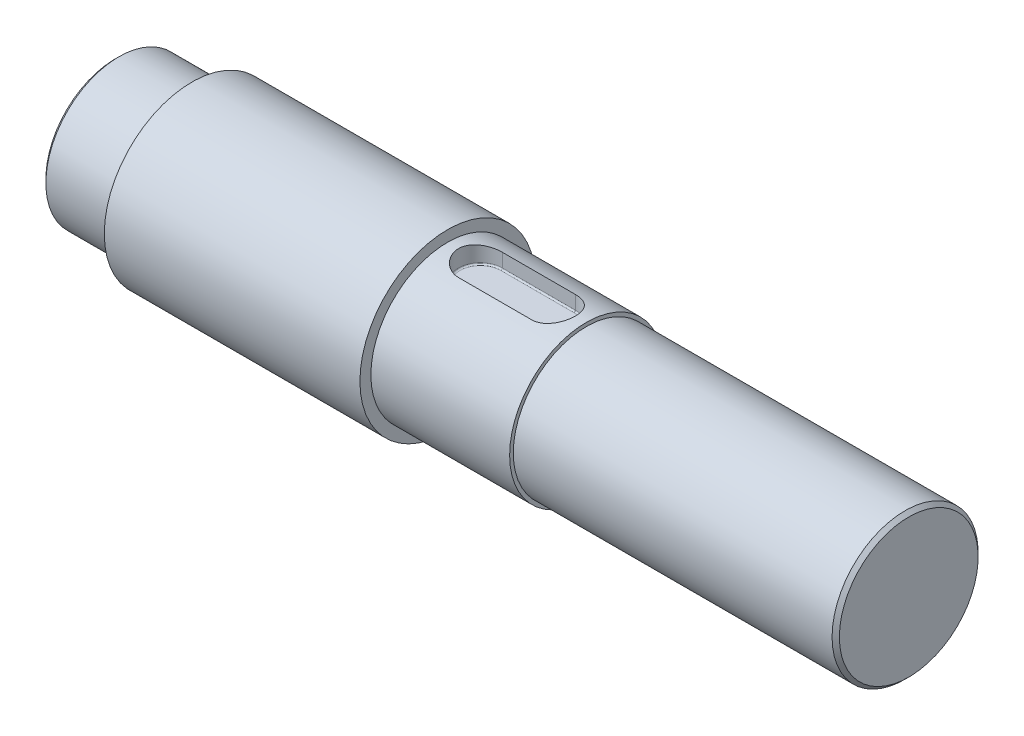
ISO-10303-21;
HEADER;
FILE_DESCRIPTION(('STEP AP214'),'2;1');
FILE_NAME('part.step','',(''),(''),'','','');
FILE_SCHEMA(('AUTOMOTIVE_DESIGN { 1 0 10303 214 1 1 1 1 }'));
ENDSEC;
DATA;
#1=APPLICATION_CONTEXT('core data for automotive mechanical design processes');
#2=APPLICATION_PROTOCOL_DEFINITION('international standard','automotive_design',2000,#1);
#3=PRODUCT_CONTEXT('',#1,'mechanical');
#4=PRODUCT('Part','Part','',(#3));
#5=PRODUCT_RELATED_PRODUCT_CATEGORY('part','',(#4));
#6=PRODUCT_DEFINITION_FORMATION('','',#4);
#7=PRODUCT_DEFINITION_CONTEXT('part definition',#1,'design');
#8=PRODUCT_DEFINITION('design','',#6,#7);
#9=PRODUCT_DEFINITION_SHAPE('','',#8);
#10=(LENGTH_UNIT() NAMED_UNIT(*) SI_UNIT(.MILLI.,.METRE.));
#11=(NAMED_UNIT(*) PLANE_ANGLE_UNIT() SI_UNIT($,.RADIAN.));
#12=(NAMED_UNIT(*) SI_UNIT($,.STERADIAN.) SOLID_ANGLE_UNIT());
#13=UNCERTAINTY_MEASURE_WITH_UNIT(LENGTH_MEASURE(1.E-05),#10,'distance_accuracy_value','');
#14=(GEOMETRIC_REPRESENTATION_CONTEXT(3) GLOBAL_UNCERTAINTY_ASSIGNED_CONTEXT((#13)) GLOBAL_UNIT_ASSIGNED_CONTEXT((#10,
#11,#12)) REPRESENTATION_CONTEXT('',''));
#15=CARTESIAN_POINT('',(0.,0.,0.));
#16=DIRECTION('',(0.,0.,1.));
#17=DIRECTION('',(1.,0.,0.));
#18=AXIS2_PLACEMENT_3D('',#15,#16,#17);
#19=CARTESIAN_POINT('',(216.8,0.,0.));
#20=DIRECTION('',(-1.,0.,0.));
#21=DIRECTION('',(0.,0.,-1.));
#22=AXIS2_PLACEMENT_3D('',#19,#20,#21);
#23=CONICAL_SURFACE('',#22,19.5,0.785398163397448);
#24=CARTESIAN_POINT('',(217.3,0.,0.));
#25=DIRECTION('',(1.,0.,0.));
#26=DIRECTION('',(0.,0.,1.));
#27=AXIS2_PLACEMENT_3D('',#24,#25,#26);
#28=CIRCLE('',#27,19.);
#29=CARTESIAN_POINT('',(217.3,0.,19.));
#30=VERTEX_POINT('',#29);
#31=EDGE_CURVE('E112',#30,#30,#28,.T.);
#32=ORIENTED_EDGE('',*,*,#31,.F.);
#33=EDGE_LOOP('',(#32));
#34=FACE_BOUND('',#33,.T.);
#35=CARTESIAN_POINT('',(216.3,0.,0.));
#36=DIRECTION('',(1.,0.,0.));
#37=DIRECTION('',(0.,0.,1.));
#38=AXIS2_PLACEMENT_3D('',#35,#36,#37);
#39=CIRCLE('',#38,20.);
#40=CARTESIAN_POINT('',(216.3,0.,20.));
#41=VERTEX_POINT('',#40);
#42=EDGE_CURVE('E123',#41,#41,#39,.T.);
#43=ORIENTED_EDGE('',*,*,#42,.T.);
#44=EDGE_LOOP('',(#43));
#45=FACE_BOUND('',#44,.T.);
#46=ADVANCED_FACE('F16',(#34,#45),#23,.T.);
#47=CARTESIAN_POINT('',(0.,0.,0.));
#48=DIRECTION('',(-1.,0.,0.));
#49=DIRECTION('',(0.,1.,0.));
#50=AXIS2_PLACEMENT_3D('',#47,#48,#49);
#51=PLANE('',#50);
#52=CARTESIAN_POINT('',(0.,0.,0.));
#53=DIRECTION('',(-1.,0.,0.));
#54=DIRECTION('',(0.,0.,-1.));
#55=AXIS2_PLACEMENT_3D('',#52,#53,#54);
#56=CIRCLE('',#55,19.);
#57=CARTESIAN_POINT('',(0.,0.,-19.));
#58=VERTEX_POINT('',#57);
#59=EDGE_CURVE('E10',#58,#58,#56,.T.);
#60=ORIENTED_EDGE('',*,*,#59,.T.);
#61=EDGE_LOOP('',(#60));
#62=FACE_BOUND('',#61,.T.);
#63=ADVANCED_FACE('F280',(#62),#51,.T.);
#64=CARTESIAN_POINT('',(0.5,0.,0.));
#65=DIRECTION('',(1.,0.,0.));
#66=DIRECTION('',(0.,0.,1.));
#67=AXIS2_PLACEMENT_3D('',#64,#65,#66);
#68=CONICAL_SURFACE('',#67,19.5,0.78539816339745);
#69=CARTESIAN_POINT('',(1.,0.,0.));
#70=DIRECTION('',(-1.,0.,0.));
#71=DIRECTION('',(0.,0.,-1.));
#72=AXIS2_PLACEMENT_3D('',#69,#70,#71);
#73=CIRCLE('',#72,20.);
#74=CARTESIAN_POINT('',(1.,0.,-20.));
#75=VERTEX_POINT('',#74);
#76=EDGE_CURVE('E25',#75,#75,#73,.T.);
#77=ORIENTED_EDGE('',*,*,#76,.T.);
#78=EDGE_LOOP('',(#77));
#79=FACE_BOUND('',#78,.T.);
#80=ORIENTED_EDGE('',*,*,#59,.F.);
#81=EDGE_LOOP('',(#80));
#82=FACE_BOUND('',#81,.T.);
#83=ADVANCED_FACE('F284',(#79,#82),#68,.T.);
#84=CARTESIAN_POINT('',(21.,0.,0.));
#85=DIRECTION('',(-1.,0.,0.));
#86=DIRECTION('',(0.,0.,-1.));
#87=AXIS2_PLACEMENT_3D('',#84,#85,#86);
#88=CYLINDRICAL_SURFACE('',#87,20.);
#89=CARTESIAN_POINT('',(21.,0.,0.));
#90=DIRECTION('',(1.,0.,0.));
#91=DIRECTION('',(0.,0.,-1.));
#92=AXIS2_PLACEMENT_3D('',#89,#90,#91);
#93=CIRCLE('',#92,20.);
#94=CARTESIAN_POINT('',(21.,0.,-20.));
#95=VERTEX_POINT('',#94);
#96=EDGE_CURVE('E116',#95,#95,#93,.T.);
#97=ORIENTED_EDGE('',*,*,#96,.F.);
#98=EDGE_LOOP('',(#97));
#99=FACE_BOUND('',#98,.T.);
#100=ORIENTED_EDGE('',*,*,#76,.F.);
#101=EDGE_LOOP('',(#100));
#102=FACE_BOUND('',#101,.T.);
#103=ADVANCED_FACE('F323',(#99,#102),#88,.T.);
#104=CARTESIAN_POINT('',(217.3,0.,0.));
#105=DIRECTION('',(1.,0.,0.));
#106=DIRECTION('',(0.,0.,-1.));
#107=AXIS2_PLACEMENT_3D('',#104,#105,#106);
#108=PLANE('',#107);
#109=ORIENTED_EDGE('',*,*,#31,.T.);
#110=EDGE_LOOP('',(#109));
#111=FACE_BOUND('',#110,.T.);
#112=ADVANCED_FACE('F113',(#111),#108,.T.);
#113=CARTESIAN_POINT('',(21.,0.,0.));
#114=DIRECTION('',(1.,0.,0.));
#115=DIRECTION('',(0.,0.,-1.));
#116=AXIS2_PLACEMENT_3D('',#113,#114,#115);
#117=PLANE('',#116);
#118=ORIENTED_EDGE('',*,*,#96,.T.);
#119=EDGE_LOOP('',(#118));
#120=FACE_BOUND('',#119,.T.);
#121=CARTESIAN_POINT('',(21.,0.,0.));
#122=DIRECTION('',(1.,0.,0.));
#123=DIRECTION('',(0.,0.,1.));
#124=AXIS2_PLACEMENT_3D('',#121,#122,#123);
#125=CIRCLE('',#124,24.);
#126=CARTESIAN_POINT('',(21.,0.,24.));
#127=VERTEX_POINT('',#126);
#128=EDGE_CURVE('E128',#127,#127,#125,.T.);
#129=ORIENTED_EDGE('',*,*,#128,.F.);
#130=EDGE_LOOP('',(#129));
#131=FACE_BOUND('',#130,.T.);
#132=ADVANCED_FACE('F292',(#120,#131),#117,.F.);
#133=CARTESIAN_POINT('',(129.,0.,0.));
#134=DIRECTION('',(1.,0.,0.));
#135=DIRECTION('',(0.,0.,1.));
#136=AXIS2_PLACEMENT_3D('',#133,#134,#135);
#137=CYLINDRICAL_SURFACE('',#136,20.);
#138=ORIENTED_EDGE('',*,*,#42,.F.);
#139=EDGE_LOOP('',(#138));
#140=FACE_BOUND('',#139,.T.);
#141=CARTESIAN_POINT('',(129.,0.,0.));
#142=DIRECTION('',(1.,0.,0.));
#143=DIRECTION('',(0.,0.,1.));
#144=AXIS2_PLACEMENT_3D('',#141,#142,#143);
#145=CIRCLE('',#144,20.);
#146=CARTESIAN_POINT('',(129.,0.,20.));
#147=VERTEX_POINT('',#146);
#148=EDGE_CURVE('E131',#147,#147,#145,.T.);
#149=ORIENTED_EDGE('',*,*,#148,.T.);
#150=EDGE_LOOP('',(#149));
#151=FACE_BOUND('',#150,.T.);
#152=ADVANCED_FACE('F288',(#140,#151),#137,.T.);
#153=CARTESIAN_POINT('',(21.,0.,0.));
#154=DIRECTION('',(1.,0.,0.));
#155=DIRECTION('',(0.,0.,1.));
#156=AXIS2_PLACEMENT_3D('',#153,#154,#155);
#157=CYLINDRICAL_SURFACE('',#156,24.);
#158=CARTESIAN_POINT('',(91.,0.,0.));
#159=DIRECTION('',(1.,0.,0.));
#160=DIRECTION('',(0.,0.,1.));
#161=AXIS2_PLACEMENT_3D('',#158,#159,#160);
#162=CIRCLE('',#161,24.);
#163=CARTESIAN_POINT('',(91.,0.,24.));
#164=VERTEX_POINT('',#163);
#165=EDGE_CURVE('E134',#164,#164,#162,.T.);
#166=ORIENTED_EDGE('',*,*,#165,.F.);
#167=EDGE_LOOP('',(#166));
#168=FACE_BOUND('',#167,.T.);
#169=ORIENTED_EDGE('',*,*,#128,.T.);
#170=EDGE_LOOP('',(#169));
#171=FACE_BOUND('',#170,.T.);
#172=ADVANCED_FACE('F291',(#168,#171),#157,.T.);
#173=CARTESIAN_POINT('',(100.,23.5,0.));
#174=DIRECTION('',(0.,-1.,0.));
#175=DIRECTION('',(0.,0.,1.));
#176=AXIS2_PLACEMENT_3D('',#173,#174,#175);
#177=CYLINDRICAL_SURFACE('',#176,6.);
#178=CARTESIAN_POINT('',(100.,20.1246117975143,6.));
#179=CARTESIAN_POINT('',(99.9394789747796,20.1246113246482,6.00000028564536));
#180=CARTESIAN_POINT('',(99.818488180797,20.1251581958696,5.998168382813));
#181=CARTESIAN_POINT('',(99.6373144630344,20.1276085423049,5.98994275664739));
#182=CARTESIAN_POINT('',(99.4565806510446,20.1316779660061,5.97625623591339));
#183=CARTESIAN_POINT('',(99.2763513088904,20.1373505818861,5.95712036951507));
#184=CARTESIAN_POINT('',(99.076629080922,20.1454193124463,5.92979259739566));
#185=CARTESIAN_POINT('',(98.8580189431179,20.1565212959502,5.89197856611017));
#186=CARTESIAN_POINT('',(98.621483214606,20.1713145230339,5.84116254568691));
#187=CARTESIAN_POINT('',(98.4068345911047,20.1872324350318,5.78591648990805));
#188=CARTESIAN_POINT('',(98.2137002480956,20.203488875005,5.72888162007691));
#189=CARTESIAN_POINT('',(98.0415890508586,20.2194386456099,5.67235005870638));
#190=CARTESIAN_POINT('',(97.8714091230813,20.2366368124012,5.61070469004631));
#191=CARTESIAN_POINT('',(97.697002089797,20.2557039040795,5.54151322314235));
#192=CARTESIAN_POINT('',(97.5126069642485,20.2774500037485,5.46147766592394));
#193=CARTESIAN_POINT('',(97.3076416108865,20.3035376827017,5.36380891137291));
#194=CARTESIAN_POINT('',(97.0843023706429,20.3342895076702,5.2462047146001));
#195=CARTESIAN_POINT('',(96.8457666120907,20.3698309068685,5.1066529001498));
#196=CARTESIAN_POINT('',(96.6052455582817,20.4084685050121,4.95015451435326));
#197=CARTESIAN_POINT('',(96.3754316756263,20.4480219425845,4.78418363657576));
#198=CARTESIAN_POINT('',(96.1662633561226,20.4862181888335,4.61781786258777));
#199=CARTESIAN_POINT('',(95.9871379969987,20.5205831826807,4.46245051213886));
#200=CARTESIAN_POINT('',(95.8354255233934,20.5508578492776,4.32068016875058));
#201=CARTESIAN_POINT('',(95.6977897924313,20.5791962294024,4.18368084366746));
#202=CARTESIAN_POINT('',(95.5649716559741,20.6073685182309,4.04277502300764));
#203=CARTESIAN_POINT('',(95.4335963604494,20.6360586686567,3.89368369112399));
#204=CARTESIAN_POINT('',(95.3208387696459,20.6613436686008,3.75696354818126));
#205=CARTESIAN_POINT('',(95.224254265902,20.683459942105,3.63299972959268));
#206=CARTESIAN_POINT('',(95.1417070411503,20.7026796922778,3.52183653714319));
#207=CARTESIAN_POINT('',(95.0620705951429,20.7215159802474,3.40927658205375));
#208=CARTESIAN_POINT('',(94.9759676060558,20.7421883068651,3.28145692371858));
#209=CARTESIAN_POINT('',(94.8835542568351,20.7647522412842,3.13591822243919));
#210=CARTESIAN_POINT('',(94.7856611439171,20.7890937824133,2.97040890330687));
#211=CARTESIAN_POINT('',(94.6982091252307,20.811219872889,2.81095330838845));
#212=CARTESIAN_POINT('',(94.6206438419956,20.8311297010648,2.65908841644615));
#213=CARTESIAN_POINT('',(94.5488068104643,20.8497934064791,2.50885664788248));
#214=CARTESIAN_POINT('',(94.4739698016319,20.8694788524079,2.34009412550817));
#215=CARTESIAN_POINT('',(94.3858620255528,20.8929604293621,2.12231148737726));
#216=CARTESIAN_POINT('',(94.29374011572,20.9179014049555,1.86285119303274));
#217=CARTESIAN_POINT('',(94.2061923983384,20.9419738648294,1.56931184841933));
#218=CARTESIAN_POINT('',(94.1425210079294,20.9597044443758,1.3080832178251));
#219=CARTESIAN_POINT('',(94.0987433598738,20.9719932031632,1.08921670264514));
#220=CARTESIAN_POINT('',(94.0707768886148,20.9798837074352,0.923174032685878));
#221=CARTESIAN_POINT('',(94.0499992839518,20.9857669242098,0.776992360806395));
#222=CARTESIAN_POINT('',(94.0343202512921,20.9902185900478,0.645203231008636));
#223=CARTESIAN_POINT('',(94.0221389592802,20.9936845091152,0.519724062499342));
#224=CARTESIAN_POINT('',(94.012280373619,20.9964940612882,0.391100085359508));
#225=CARTESIAN_POINT('',(94.0049987801309,20.9985720772816,0.257991634471179));
#226=CARTESIAN_POINT('',(94.0008418134001,20.9997594625978,0.124804714812628));
#227=CARTESIAN_POINT('',(93.9999560858721,21.0000125471034,0.034995452407559));
#228=CARTESIAN_POINT('',(94.0000399050803,20.999988598521,-0.0402999652409638));
#229=CARTESIAN_POINT('',(94.0007170838493,20.9997951122731,-0.107510381689692));
#230=CARTESIAN_POINT('',(94.0031446739508,20.9991016674913,-0.201711525751177));
#231=CARTESIAN_POINT('',(94.0070598383489,20.9979838373265,-0.29605909231707));
#232=CARTESIAN_POINT('',(94.0124862390277,20.9964356363685,-0.390757938456247));
#233=CARTESIAN_POINT('',(94.0194421326173,20.9944529393418,-0.485765335996435));
#234=CARTESIAN_POINT('',(94.0279563537566,20.9920289390036,-0.581177013448924));
#235=CARTESIAN_POINT('',(94.0380453863046,20.9891606927941,-0.676909038016431));
#236=CARTESIAN_POINT('',(94.0497445383763,20.9858402800072,-0.773047257784513));
#237=CARTESIAN_POINT('',(94.0630515257505,20.9820708263785,-0.869373035673871));
#238=CARTESIAN_POINT('',(94.0781661912054,20.9777986719694,-0.967051682721166));
#239=CARTESIAN_POINT('',(94.0953512136583,20.9729533883645,-1.06709571258071));
#240=CARTESIAN_POINT('',(94.1151989953263,20.9673733364854,-1.17178568751607));
#241=CARTESIAN_POINT('',(94.1379358648407,20.9610022022156,-1.28084625812271));
#242=CARTESIAN_POINT('',(94.1677459493018,20.952681026665,-1.41133094580271));
#243=CARTESIAN_POINT('',(94.2064104783368,20.9419441756409,-1.56359555102246));
#244=CARTESIAN_POINT('',(94.2565457098485,20.9281237677804,-1.73909259151272));
#245=CARTESIAN_POINT('',(94.310165898284,20.9134707736959,-1.90677473702942));
#246=CARTESIAN_POINT('',(94.3658147917176,20.8984009463608,-2.06494514260749));
#247=CARTESIAN_POINT('',(94.421937230358,20.8833358095419,-2.21217422019243));
#248=CARTESIAN_POINT('',(94.4831659100035,20.8670600055079,-2.36079173677895));
#249=CARTESIAN_POINT('',(94.5490788851347,20.8497267544884,-2.50923742690954));
#250=CARTESIAN_POINT('',(94.6188231376647,20.8315979450668,-2.65549292469975));
#251=CARTESIAN_POINT('',(94.6915807880851,20.8129191159587,-2.79805316117478));
#252=CARTESIAN_POINT('',(94.7668034918903,20.7938580981672,-2.93627750868576));
#253=CARTESIAN_POINT('',(94.8435104024806,20.7746842871386,-3.06891743848002));
#254=CARTESIAN_POINT('',(94.9214625400344,20.7554722272717,-3.19619036666268));
#255=CARTESIAN_POINT('',(94.9999475472713,20.7364069023102,-3.31756730274912));
#256=CARTESIAN_POINT('',(95.0794887208953,20.7173701416658,-3.43439311034796));
#257=CARTESIAN_POINT('',(95.1602357168056,20.6983385473654,-3.54725751145822));
#258=CARTESIAN_POINT('',(95.2429623263929,20.6791488689451,-3.65744070353218));
#259=CARTESIAN_POINT('',(95.3280839810739,20.6597298147409,-3.76557129629775));
#260=CARTESIAN_POINT('',(95.4161249671813,20.6399943092811,-3.87227588716648));
#261=CARTESIAN_POINT('',(95.5080499564943,20.6197676327782,-3.97857668774506));
#262=CARTESIAN_POINT('',(95.6043841096568,20.5989884602812,-4.08480166294358));
#263=CARTESIAN_POINT('',(95.7062241765655,20.5774884340454,-4.19177216557071));
#264=CARTESIAN_POINT('',(95.813278144941,20.5554074547812,-4.29874621999162));
#265=CARTESIAN_POINT('',(95.9309096091775,20.5317479919017,-4.41042288374334));
#266=CARTESIAN_POINT('',(96.0638926230854,20.5057627046957,-4.52981170905476));
#267=CARTESIAN_POINT('',(96.2382280223323,20.4728725661648,-4.67659443645894));
#268=CARTESIAN_POINT('',(96.4519546864786,20.434509335884,-4.84171608718773));
#269=CARTESIAN_POINT('',(96.7031202312309,20.3923510979224,-5.01618409901877));
#270=CARTESIAN_POINT('',(96.9381969922901,20.3557790707075,-5.1622187136673));
#271=CARTESIAN_POINT('',(97.147402876793,20.3255161147446,-5.27984563336737));
#272=CARTESIAN_POINT('',(97.3210600242576,20.3019121711754,-5.36980462123828));
#273=CARTESIAN_POINT('',(97.4854332171794,20.2808952463345,-5.44859792428823));
#274=CARTESIAN_POINT('',(97.6451280106877,20.2617121693082,-5.51948281627222));
#275=CARTESIAN_POINT('',(97.805513990064,20.2436975074571,-5.58517095061313));
#276=CARTESIAN_POINT('',(97.9656736015219,20.2269629602755,-5.64545495371749));
#277=CARTESIAN_POINT('',(98.1256571777559,20.2115002308871,-5.70054803936327));
#278=CARTESIAN_POINT('',(98.3020890803304,20.1958293019678,-5.75583087470647));
#279=CARTESIAN_POINT('',(98.4956314944935,20.1803965033116,-5.80970453373366));
#280=CARTESIAN_POINT('',(98.7061963716891,20.1657936585233,-5.86016561347842));
#281=CARTESIAN_POINT('',(98.8988458449718,20.1544354353187,-5.8990793022198));
#282=CARTESIAN_POINT('',(99.0732791417516,20.145735938447,-5.92870465469931));
#283=CARTESIAN_POINT('',(99.2292719826322,20.1391646231348,-5.95098263626527));
#284=CARTESIAN_POINT('',(99.3847165714072,20.1338166341144,-5.96904675636665));
#285=CARTESIAN_POINT('',(99.5393358550212,20.1296864446243,-5.98295696342633));
#286=CARTESIAN_POINT('',(99.6933854672313,20.1267520271588,-5.99281847542322));
#287=CARTESIAN_POINT('',(99.8468078525564,20.1250005759871,-5.99869653617302));
#288=CARTESIAN_POINT('',(99.9489959729256,20.1246115502327,-6.00000016658741));
#289=CARTESIAN_POINT('',(100.,20.1246117974981,-6.));
#290=(BOUNDED_CURVE() B_SPLINE_CURVE(3,(#178,#179,#180,#181,#182,#183,#184,#185,#186,#187,#188,
#189,#190,#191,#192,#193,#194,#195,#196,#197,#198,#199,#200,#201,#202,#203,#204,#205,#206,#207,
#208,#209,#210,#211,#212,#213,#214,#215,#216,#217,#218,#219,#220,#221,#222,#223,#224,#225,#226,
#227,#228,#229,#230,#231,#232,#233,#234,#235,#236,#237,#238,#239,#240,#241,#242,#243,#244,#245,
#246,#247,#248,#249,#250,#251,#252,#253,#254,#255,#256,#257,#258,#259,#260,#261,#262,#263,#264,
#265,#266,#267,#268,#269,#270,#271,#272,#273,#274,#275,#276,#277,#278,#279,#280,#281,#282,#283,
#284,#285,#286,#287,#288,#289),.UNSPECIFIED.,.F.,.F.) B_SPLINE_CURVE_WITH_KNOTS((4,1,1,1,1,1,1,
1,1,1,1,1,1,1,1,1,1,1,1,1,1,1,1,1,1,1,1,1,1,1,1,1,1,1,1,1,1,1,1,1,1,1,1,1,1,1,1,1,1,1,1,1,1,1,1,
1,1,1,1,1,1,1,1,1,1,1,1,1,1,1,1,1,1,1,1,1,1,1,1,1,1,1,1,1,1,1,1,1,1,1,1,1,1,1,1,1,1,1,1,1,1,1,1,
1,1,1,1,1,1,4),(0.,0.0095635248106059,0.0191269467368199,0.0286892694770454,0.0382557009074643,
0.0478363687791667,0.0606398049221241,0.0734383196723692,0.0862260208402685,0.0958257313613232,
0.105424570999342,0.115013893446736,0.124604338778036,0.135275682156621,0.147015179185779,
0.160776439564555,0.175521034699259,0.191119127594063,0.206605989420137,0.220822709597588,
0.233849541207332,0.244529530810296,0.254038890973945,0.264916722436611,0.275504523490756,
0.28582176020443,0.293254944106785,0.300627824266122,0.307951228515885,0.315285377033579,
0.325243643375289,0.335474266106868,0.345967271789971,0.354243764557628,0.362652344838585,
0.372492891738396,0.383632039771305,0.400023740470073,0.416243371916697,0.432256696193256,
0.44266811690409,0.451627711896569,0.458939854854647,0.466059198167256,0.472647534061089,
0.478902478064672,0.486482987420574,0.493749909804777,0.499994493811702,0.500699360796722,
0.505669035781398,0.510634180153582,0.51561689774422,0.520618738570177,0.525652501116034,
0.530701193409011,0.535788474006187,0.540898739969239,0.546042198940465,0.551194040233464,
0.5565604175305,0.562129605525507,0.56808467968717,0.574224307932504,0.583357746280639,
0.593008777863647,0.603196657610565,0.611319919723224,0.619658075685179,0.628252134406979,
0.636893993419048,0.645514972154462,0.654061747168478,0.662402020602816,0.670608108595007,
0.678506461833341,0.686223518170854,0.693687899306447,0.701082289596139,0.708397979083923,
0.715710221978644,0.723083458035403,0.730519418844678,0.738187388780529,0.746022341509519,
0.754147462430789,0.762399517332896,0.771971520010442,0.782735400305954,0.798848329158001,
0.815144463527043,0.83159100338576,0.843028911434809,0.853438863650694,0.862776455461267,
0.872076230530395,0.881261702148353,0.890357607906408,0.899292339088054,0.908155758718946,
0.919728444960743,0.931186478929145,0.942513226357996,0.950903382498197,0.959243463952533,
0.967492354611135,0.975701341872282,0.983833886966147,0.9919332155536,1.),
.UNSPECIFIED.) CURVE() GEOMETRIC_REPRESENTATION_ITEM() RATIONAL_B_SPLINE_CURVE((1.,1.,1.,1.,1.,
1.,1.,1.,1.,1.,1.,1.,1.,1.,1.,1.,1.,1.,1.,1.,1.,1.,1.,1.,1.,1.,1.,1.,1.,1.,1.,1.,1.,1.,1.,1.,1.,
1.,1.,1.,1.,1.,1.,1.,1.,1.,1.,1.,1.,1.,1.,1.,1.,1.,1.,1.,1.,1.,1.,1.,1.,1.,1.,1.,1.,1.,1.,1.,1.,
1.,1.,1.,1.,1.,1.,1.,1.,1.,1.,1.,1.,1.,1.,1.,1.,1.,1.,1.,1.,1.,1.,1.,1.,1.,1.,1.,1.,1.,1.,1.,1.,
1.,1.,1.,1.,1.,1.,1.,1.,1.,1.,1.)) REPRESENTATION_ITEM(''));
#291=CARTESIAN_POINT('',(100.,20.1246117974981,6.));
#292=VERTEX_POINT('',#291);
#293=CARTESIAN_POINT('',(100.,20.1246117974981,-6.));
#294=VERTEX_POINT('',#293);
#295=EDGE_CURVE('E180',#292,#294,#290,.T.);
#296=ORIENTED_EDGE('',*,*,#295,.F.);
#297=DIRECTION('',(0.,1.,0.));
#298=VECTOR('',#297,1.);
#299=CARTESIAN_POINT('',(100.,20.1246117974981,6.));
#300=LINE('',#299,#298);
#301=CARTESIAN_POINT('',(100.,16.4,6.));
#302=VERTEX_POINT('',#301);
#303=EDGE_CURVE('E158',#302,#292,#300,.T.);
#304=ORIENTED_EDGE('',*,*,#303,.F.);
#305=CARTESIAN_POINT('',(100.,16.4,0.));
#306=DIRECTION('',(0.,-1.,0.));
#307=DIRECTION('',(0.,0.,1.));
#308=AXIS2_PLACEMENT_3D('',#305,#306,#307);
#309=CIRCLE('',#308,6.);
#310=CARTESIAN_POINT('',(100.,16.4,-6.));
#311=VERTEX_POINT('',#310);
#312=EDGE_CURVE('E137',#302,#311,#309,.T.);
#313=ORIENTED_EDGE('',*,*,#312,.T.);
#314=DIRECTION('',(0.,-1.,0.));
#315=VECTOR('',#314,1.);
#316=CARTESIAN_POINT('',(100.,20.1246117974981,-6.));
#317=LINE('',#316,#315);
#318=EDGE_CURVE('E167',#294,#311,#317,.T.);
#319=ORIENTED_EDGE('',*,*,#318,.F.);
#320=EDGE_LOOP('',(#296,#304,#313,#319));
#321=FACE_BOUND('',#320,.T.);
#322=ADVANCED_FACE('F262',(#321),#177,.F.);
#323=CARTESIAN_POINT('',(129.,0.,0.));
#324=DIRECTION('',(1.,0.,0.));
#325=DIRECTION('',(0.,0.,-1.));
#326=AXIS2_PLACEMENT_3D('',#323,#324,#325);
#327=PLANE('',#326);
#328=ORIENTED_EDGE('',*,*,#148,.F.);
#329=EDGE_LOOP('',(#328));
#330=FACE_BOUND('',#329,.T.);
#331=CARTESIAN_POINT('',(129.,0.,0.));
#332=DIRECTION('',(1.,0.,0.));
#333=DIRECTION('',(0.,0.,1.));
#334=AXIS2_PLACEMENT_3D('',#331,#332,#333);
#335=CIRCLE('',#334,21.);
#336=CARTESIAN_POINT('',(129.,0.,21.));
#337=VERTEX_POINT('',#336);
#338=EDGE_CURVE('E175',#337,#337,#335,.T.);
#339=ORIENTED_EDGE('',*,*,#338,.T.);
#340=EDGE_LOOP('',(#339));
#341=FACE_BOUND('',#340,.T.);
#342=ADVANCED_FACE('F296',(#330,#341),#327,.T.);
#343=CARTESIAN_POINT('',(91.,0.,0.));
#344=DIRECTION('',(1.,0.,0.));
#345=DIRECTION('',(0.,0.,-1.));
#346=AXIS2_PLACEMENT_3D('',#343,#344,#345);
#347=PLANE('',#346);
#348=CARTESIAN_POINT('',(91.,0.,0.));
#349=DIRECTION('',(1.,0.,0.));
#350=DIRECTION('',(0.,0.,1.));
#351=AXIS2_PLACEMENT_3D('',#348,#349,#350);
#352=CIRCLE('',#351,21.);
#353=CARTESIAN_POINT('',(91.,0.,21.));
#354=VERTEX_POINT('',#353);
#355=EDGE_CURVE('E179',#354,#354,#352,.T.);
#356=ORIENTED_EDGE('',*,*,#355,.F.);
#357=EDGE_LOOP('',(#356));
#358=FACE_BOUND('',#357,.T.);
#359=ORIENTED_EDGE('',*,*,#165,.T.);
#360=EDGE_LOOP('',(#359));
#361=FACE_BOUND('',#360,.T.);
#362=ADVANCED_FACE('F299',(#358,#361),#347,.T.);
#363=CARTESIAN_POINT('',(100.,16.4,0.));
#364=DIRECTION('',(0.,-1.,0.));
#365=DIRECTION('',(0.,0.,1.));
#366=AXIS2_PLACEMENT_3D('',#363,#364,#365);
#367=TOROIDAL_SURFACE('',#366,5.6,0.4);
#368=CARTESIAN_POINT('',(100.,16.4,5.6));
#369=DIRECTION('',(-1.,0.,0.));
#370=DIRECTION('',(0.,-1.,0.));
#371=AXIS2_PLACEMENT_3D('',#368,#369,#370);
#372=CIRCLE('',#371,0.4);
#373=CARTESIAN_POINT('',(100.,16.,5.6));
#374=VERTEX_POINT('',#373);
#375=EDGE_CURVE('E141',#374,#302,#372,.T.);
#376=ORIENTED_EDGE('',*,*,#375,.F.);
#377=CARTESIAN_POINT('',(100.,16.,0.));
#378=DIRECTION('',(0.,-1.,0.));
#379=DIRECTION('',(0.,0.,1.));
#380=AXIS2_PLACEMENT_3D('',#377,#378,#379);
#381=CIRCLE('',#380,5.6);
#382=CARTESIAN_POINT('',(100.,16.,-5.6));
#383=VERTEX_POINT('',#382);
#384=EDGE_CURVE('E214',#374,#383,#381,.T.);
#385=ORIENTED_EDGE('',*,*,#384,.T.);
#386=CARTESIAN_POINT('',(100.,16.4,-5.6));
#387=DIRECTION('',(-1.,0.,0.));
#388=DIRECTION('',(0.,0.,-1.));
#389=AXIS2_PLACEMENT_3D('',#386,#387,#388);
#390=CIRCLE('',#389,0.4);
#391=EDGE_CURVE('E148',#311,#383,#390,.T.);
#392=ORIENTED_EDGE('',*,*,#391,.F.);
#393=ORIENTED_EDGE('',*,*,#312,.F.);
#394=EDGE_LOOP('',(#376,#385,#392,#393));
#395=FACE_BOUND('',#394,.T.);
#396=ADVANCED_FACE('F264',(#395),#367,.F.);
#397=CARTESIAN_POINT('',(120.,16.4,0.));
#398=DIRECTION('',(0.,-1.,0.));
#399=DIRECTION('',(0.,0.,-1.));
#400=AXIS2_PLACEMENT_3D('',#397,#398,#399);
#401=TOROIDAL_SURFACE('',#400,5.6,0.4);
#402=CARTESIAN_POINT('',(120.,16.4,-5.6));
#403=DIRECTION('',(1.,0.,0.));
#404=DIRECTION('',(0.,0.,-1.));
#405=AXIS2_PLACEMENT_3D('',#402,#403,#404);
#406=CIRCLE('',#405,0.4);
#407=CARTESIAN_POINT('',(120.,16.,-5.6));
#408=VERTEX_POINT('',#407);
#409=CARTESIAN_POINT('',(120.,16.4,-6.));
#410=VERTEX_POINT('',#409);
#411=EDGE_CURVE('E152',#408,#410,#406,.T.);
#412=ORIENTED_EDGE('',*,*,#411,.F.);
#413=CARTESIAN_POINT('',(120.,16.,0.));
#414=DIRECTION('',(0.,-1.,0.));
#415=DIRECTION('',(0.,0.,-1.));
#416=AXIS2_PLACEMENT_3D('',#413,#414,#415);
#417=CIRCLE('',#416,5.6);
#418=CARTESIAN_POINT('',(120.,16.,5.6));
#419=VERTEX_POINT('',#418);
#420=EDGE_CURVE('E192',#408,#419,#417,.T.);
#421=ORIENTED_EDGE('',*,*,#420,.T.);
#422=CARTESIAN_POINT('',(120.,16.4,5.6));
#423=DIRECTION('',(1.,0.,0.));
#424=DIRECTION('',(0.,-1.,0.));
#425=AXIS2_PLACEMENT_3D('',#422,#423,#424);
#426=CIRCLE('',#425,0.4);
#427=CARTESIAN_POINT('',(120.,16.4,6.));
#428=VERTEX_POINT('',#427);
#429=EDGE_CURVE('E145',#428,#419,#426,.T.);
#430=ORIENTED_EDGE('',*,*,#429,.F.);
#431=CARTESIAN_POINT('',(120.,16.4,0.));
#432=DIRECTION('',(0.,-1.,0.));
#433=DIRECTION('',(0.,0.,-1.));
#434=AXIS2_PLACEMENT_3D('',#431,#432,#433);
#435=CIRCLE('',#434,6.);
#436=EDGE_CURVE('E138',#410,#428,#435,.T.);
#437=ORIENTED_EDGE('',*,*,#436,.F.);
#438=EDGE_LOOP('',(#412,#421,#430,#437));
#439=FACE_BOUND('',#438,.T.);
#440=ADVANCED_FACE('F245',(#439),#401,.F.);
#441=CARTESIAN_POINT('',(120.,23.5,0.));
#442=DIRECTION('',(0.,-1.,0.));
#443=DIRECTION('',(0.,0.,-1.));
#444=AXIS2_PLACEMENT_3D('',#441,#442,#443);
#445=CYLINDRICAL_SURFACE('',#444,6.);
#446=DIRECTION('',(0.,-1.,0.));
#447=VECTOR('',#446,1.);
#448=CARTESIAN_POINT('',(120.,20.1246117974981,6.));
#449=LINE('',#448,#447);
#450=CARTESIAN_POINT('',(120.,20.1246117974981,6.));
#451=VERTEX_POINT('',#450);
#452=EDGE_CURVE('E166',#451,#428,#449,.T.);
#453=ORIENTED_EDGE('',*,*,#452,.F.);
#454=CARTESIAN_POINT('',(120.,20.1246117974981,-6.));
#455=CARTESIAN_POINT('',(120.06052102522,20.124611324642,-6.00000028564538));
#456=CARTESIAN_POINT('',(120.181511819203,20.1251581958725,-5.99816838281302));
#457=CARTESIAN_POINT('',(120.362685536966,20.1276085423041,-5.98994275664739));
#458=CARTESIAN_POINT('',(120.543419348956,20.1316779660063,-5.9762562359134));
#459=CARTESIAN_POINT('',(120.72364869111,20.1373505818861,-5.95712036951505));
#460=CARTESIAN_POINT('',(120.923370919078,20.1454193124463,-5.92979259739564));
#461=CARTESIAN_POINT('',(121.141981056882,20.1565212959502,-5.89197856611015));
#462=CARTESIAN_POINT('',(121.378516785394,20.1713145230339,-5.8411625456869));
#463=CARTESIAN_POINT('',(121.593165408895,20.1872324350318,-5.78591648990806));
#464=CARTESIAN_POINT('',(121.786299751904,20.203488875005,-5.72888162007695));
#465=CARTESIAN_POINT('',(121.958410949141,20.2194386456099,-5.67235005870641));
#466=CARTESIAN_POINT('',(122.128590876919,20.2366368124012,-5.61070469004637));
#467=CARTESIAN_POINT('',(122.302997910203,20.2557039040795,-5.5415132231424));
#468=CARTESIAN_POINT('',(122.487393035751,20.2774500037484,-5.461477665924));
#469=CARTESIAN_POINT('',(122.692358389113,20.3035376827017,-5.36380891137293));
#470=CARTESIAN_POINT('',(122.915697629357,20.3342895076702,-5.24620471460013));
#471=CARTESIAN_POINT('',(123.154233387909,20.3698309068685,-5.10665290014978));
#472=CARTESIAN_POINT('',(123.394754441718,20.4084685050121,-4.95015451435325));
#473=CARTESIAN_POINT('',(123.624568324374,20.4480219425845,-4.78418363657571));
#474=CARTESIAN_POINT('',(123.833736643877,20.4862181888335,-4.61781786258772));
#475=CARTESIAN_POINT('',(124.012862003001,20.5205831826807,-4.46245051213883));
#476=CARTESIAN_POINT('',(124.164574476607,20.5508578492776,-4.32068016875056));
#477=CARTESIAN_POINT('',(124.302210207569,20.5791962294024,-4.18368084366747));
#478=CARTESIAN_POINT('',(124.435028344026,20.6073685182309,-4.04277502300764));
#479=CARTESIAN_POINT('',(124.566403639551,20.6360586686567,-3.89368369112403));
#480=CARTESIAN_POINT('',(124.679161230354,20.6613436686008,-3.7569635481813));
#481=CARTESIAN_POINT('',(124.775745734098,20.683459942105,-3.6329997295927));
#482=CARTESIAN_POINT('',(124.85829295885,20.7026796922778,-3.52183653714322));
#483=CARTESIAN_POINT('',(124.937929404857,20.7215159802474,-3.4092765820538));
#484=CARTESIAN_POINT('',(125.024032393944,20.7421883068651,-3.28145692371859));
#485=CARTESIAN_POINT('',(125.116445743165,20.7647522412842,-3.13591822243923));
#486=CARTESIAN_POINT('',(125.214338856083,20.7890937824133,-2.97040890330689));
#487=CARTESIAN_POINT('',(125.301790874769,20.811219872889,-2.81095330838846));
#488=CARTESIAN_POINT('',(125.379356158004,20.8311297010648,-2.65908841644616));
#489=CARTESIAN_POINT('',(125.451193189536,20.8497934064791,-2.5088566478825));
#490=CARTESIAN_POINT('',(125.526030198368,20.8694788524079,-2.34009412550819));
#491=CARTESIAN_POINT('',(125.614137974447,20.8929604293621,-2.12231148737727));
#492=CARTESIAN_POINT('',(125.70625988428,20.9179014049555,-1.86285119303276));
#493=CARTESIAN_POINT('',(125.793807601662,20.9419738648294,-1.56931184841935));
#494=CARTESIAN_POINT('',(125.857478992071,20.9597044443758,-1.30808321782511));
#495=CARTESIAN_POINT('',(125.901256640126,20.9719932031632,-1.08921670264516));
#496=CARTESIAN_POINT('',(125.929223111385,20.9798837074352,-0.923174032685892));
#497=CARTESIAN_POINT('',(125.950000716048,20.9857669242098,-0.776992360806399));
#498=CARTESIAN_POINT('',(125.965679748708,20.9902185900478,-0.645203231008642));
#499=CARTESIAN_POINT('',(125.97786104072,20.9936845091152,-0.519724062499337));
#500=CARTESIAN_POINT('',(125.987719626381,20.9964940612882,-0.391100085359498));
#501=CARTESIAN_POINT('',(125.995001219869,20.9985720772816,-0.257991634471169));
#502=CARTESIAN_POINT('',(125.9991581866,20.9997594625978,-0.12480471481262));
#503=CARTESIAN_POINT('',(126.000043914128,21.0000125471034,-0.0349954524075692));
#504=CARTESIAN_POINT('',(125.99996009492,20.999988598521,0.0402999652409432));
#505=CARTESIAN_POINT('',(125.999282916151,20.9997951122731,0.107510381689661));
#506=CARTESIAN_POINT('',(125.996855326049,20.9991016674913,0.201711525751135));
#507=CARTESIAN_POINT('',(125.992940161651,20.9979838373265,0.296059092317047));
#508=CARTESIAN_POINT('',(125.987513760972,20.9964356363685,0.390757938456221));
#509=CARTESIAN_POINT('',(125.980557867383,20.9944529393418,0.485765335996422));
#510=CARTESIAN_POINT('',(125.972043646243,20.9920289390036,0.581177013448898));
#511=CARTESIAN_POINT('',(125.961954613695,20.9891606927941,0.676909038016416));
#512=CARTESIAN_POINT('',(125.950255461624,20.9858402800072,0.773047257784499));
#513=CARTESIAN_POINT('',(125.93694847425,20.9820708263785,0.869373035673856));
#514=CARTESIAN_POINT('',(125.921833808795,20.9777986719694,0.967051682721149));
#515=CARTESIAN_POINT('',(125.904648786342,20.9729533883645,1.06709571258069));
#516=CARTESIAN_POINT('',(125.884801004674,20.9673733364854,1.17178568751606));
#517=CARTESIAN_POINT('',(125.862064135159,20.9610022022156,1.28084625812269));
#518=CARTESIAN_POINT('',(125.832254050698,20.952681026665,1.4113309458027));
#519=CARTESIAN_POINT('',(125.793589521663,20.9419441756409,1.56359555102244));
#520=CARTESIAN_POINT('',(125.743454290151,20.9281237677804,1.73909259151273));
#521=CARTESIAN_POINT('',(125.689834101716,20.9134707736959,1.90677473702941));
#522=CARTESIAN_POINT('',(125.634185208282,20.8984009463608,2.06494514260748));
#523=CARTESIAN_POINT('',(125.578062769642,20.883335809542,2.21217422019239));
#524=CARTESIAN_POINT('',(125.516834089996,20.8670600055079,2.36079173677892));
#525=CARTESIAN_POINT('',(125.450921114865,20.8497267544884,2.50923742690952));
#526=CARTESIAN_POINT('',(125.381176862335,20.8315979450668,2.65549292469972));
#527=CARTESIAN_POINT('',(125.308419211915,20.8129191159587,2.79805316117476));
#528=CARTESIAN_POINT('',(125.23319650811,20.7938580981673,2.93627750868573));
#529=CARTESIAN_POINT('',(125.156489597519,20.7746842871386,3.06891743848));
#530=CARTESIAN_POINT('',(125.078537459966,20.7554722272717,3.19619036666266));
#531=CARTESIAN_POINT('',(125.000052452729,20.7364069023102,3.31756730274911));
#532=CARTESIAN_POINT('',(124.920511279105,20.7173701416658,3.43439311034795));
#533=CARTESIAN_POINT('',(124.839764283194,20.6983385473654,3.54725751145822));
#534=CARTESIAN_POINT('',(124.757037673607,20.6791488689451,3.65744070353216));
#535=CARTESIAN_POINT('',(124.671916018926,20.6597298147409,3.76557129629774));
#536=CARTESIAN_POINT('',(124.583875032819,20.6399943092811,3.87227588716647));
#537=CARTESIAN_POINT('',(124.491950043506,20.6197676327782,3.97857668774504));
#538=CARTESIAN_POINT('',(124.395615890343,20.5989884602812,4.08480166294359));
#539=CARTESIAN_POINT('',(124.293775823435,20.5774884340454,4.19177216557071));
#540=CARTESIAN_POINT('',(124.186721855059,20.5554074547812,4.29874621999164));
#541=CARTESIAN_POINT('',(124.069090390823,20.5317479919017,4.41042288374334));
#542=CARTESIAN_POINT('',(123.936107376915,20.5057627046957,4.52981170905478));
#543=CARTESIAN_POINT('',(123.761771977668,20.4728725661648,4.67659443645893));
#544=CARTESIAN_POINT('',(123.548045313521,20.434509335884,4.84171608718773));
#545=CARTESIAN_POINT('',(123.296879768769,20.3923510979224,5.01618409901877));
#546=CARTESIAN_POINT('',(123.06180300771,20.3557790707075,5.16221871366725));
#547=CARTESIAN_POINT('',(122.852597123207,20.3255161147446,5.27984563336737));
#548=CARTESIAN_POINT('',(122.678939975742,20.3019121711754,5.36980462123826));
#549=CARTESIAN_POINT('',(122.514566782821,20.2808952463344,5.44859792428822));
#550=CARTESIAN_POINT('',(122.354871989312,20.2617121693082,5.51948281627221));
#551=CARTESIAN_POINT('',(122.194486009936,20.2436975074571,5.58517095061313));
#552=CARTESIAN_POINT('',(122.034326398478,20.2269629602755,5.64545495371747));
#553=CARTESIAN_POINT('',(121.874342822244,20.2115002308871,5.70054803936325));
#554=CARTESIAN_POINT('',(121.69791091967,20.1958293019678,5.75583087470645));
#555=CARTESIAN_POINT('',(121.504368505506,20.1803965033116,5.80970453373366));
#556=CARTESIAN_POINT('',(121.293803628311,20.1657936585233,5.86016561347839));
#557=CARTESIAN_POINT('',(121.101154155028,20.1544354353187,5.8990793022198));
#558=CARTESIAN_POINT('',(120.926720858248,20.145735938447,5.9287046546993));
#559=CARTESIAN_POINT('',(120.770728017368,20.1391646231347,5.95098263626527));
#560=CARTESIAN_POINT('',(120.615283428593,20.1338166341144,5.96904675636664));
#561=CARTESIAN_POINT('',(120.460664144979,20.1296864446243,5.98295696342633));
#562=CARTESIAN_POINT('',(120.306614532769,20.1267520271588,5.99281847542321));
#563=CARTESIAN_POINT('',(120.153192147444,20.1250005759872,5.99869653617301));
#564=CARTESIAN_POINT('',(120.051004027074,20.1246115502327,6.0000001665874));
#565=CARTESIAN_POINT('',(120.,20.1246117974981,6.));
#566=(BOUNDED_CURVE() B_SPLINE_CURVE(3,(#454,#455,#456,#457,#458,#459,#460,#461,#462,#463,#464,
#465,#466,#467,#468,#469,#470,#471,#472,#473,#474,#475,#476,#477,#478,#479,#480,#481,#482,#483,
#484,#485,#486,#487,#488,#489,#490,#491,#492,#493,#494,#495,#496,#497,#498,#499,#500,#501,#502,
#503,#504,#505,#506,#507,#508,#509,#510,#511,#512,#513,#514,#515,#516,#517,#518,#519,#520,#521,
#522,#523,#524,#525,#526,#527,#528,#529,#530,#531,#532,#533,#534,#535,#536,#537,#538,#539,#540,
#541,#542,#543,#544,#545,#546,#547,#548,#549,#550,#551,#552,#553,#554,#555,#556,#557,#558,#559,
#560,#561,#562,#563,#564,#565),.UNSPECIFIED.,.F.,.F.) B_SPLINE_CURVE_WITH_KNOTS((4,1,1,1,1,1,1,
1,1,1,1,1,1,1,1,1,1,1,1,1,1,1,1,1,1,1,1,1,1,1,1,1,1,1,1,1,1,1,1,1,1,1,1,1,1,1,1,1,1,1,1,1,1,1,1,
1,1,1,1,1,1,1,1,1,1,1,1,1,1,1,1,1,1,1,1,1,1,1,1,1,1,1,1,1,1,1,1,1,1,1,1,1,1,1,1,1,1,1,1,1,1,1,1,
1,1,1,1,1,1,4),(0.,0.00956352481061919,0.019126946736837,0.0286892694770665,0.0382557009074879,
0.0478363687791854,0.0606398049221333,0.0734383196723741,0.0862260208402674,0.0958257313613165,
0.105424570999332,0.115013893446725,0.124604338778025,0.135275682156615,0.147015179185775,
0.160776439564558,0.175521034699263,0.191119127594071,0.206605989420144,0.220822709597593,
0.233849541207338,0.244529530810298,0.254038890973947,0.264916722436609,0.275504523490753,
0.285821760204427,0.293254944106782,0.300627824266121,0.307951228515883,0.315285377033578,
0.32524364337529,0.335474266106869,0.345967271789971,0.354243764557628,0.362652344838585,
0.372492891738396,0.383632039771305,0.400023740470072,0.416243371916696,0.432256696193255,
0.44266811690409,0.45162771189657,0.458939854854646,0.466059198167257,0.472647534061089,
0.478902478064674,0.486482987420575,0.493749909804778,0.499994493811702,0.500699360796722,
0.505669035781396,0.510634180153581,0.515616897744219,0.520618738570177,0.525652501116033,
0.530701193409011,0.535788474006186,0.54089873996924,0.546042198940465,0.551194040233463,
0.5565604175305,0.562129605525507,0.56808467968717,0.574224307932503,0.583357746280639,
0.593008777863647,0.603196657610566,0.611319919723223,0.619658075685179,0.628252134406978,
0.636893993419046,0.645514972154461,0.654061747168476,0.662402020602816,0.670608108595006,
0.67850646183334,0.686223518170853,0.693687899306446,0.701082289596139,0.708397979083925,
0.715710221978645,0.723083458035403,0.73051941884468,0.73818738878053,0.74602234150952,
0.754147462430791,0.7623995173329,0.771971520010445,0.782735400305955,0.798848329158,
0.815144463527041,0.83159100338576,0.843028911434808,0.853438863650693,0.862776455461268,
0.872076230530396,0.881261702148353,0.890357607906408,0.899292339088054,0.908155758718946,
0.919728444960743,0.931186478929146,0.942513226357999,0.950903382498201,0.959243463952534,
0.967492354611135,0.975701341872284,0.983833886966149,0.991933215553601,1.),
.UNSPECIFIED.) CURVE() GEOMETRIC_REPRESENTATION_ITEM() RATIONAL_B_SPLINE_CURVE((1.,1.,1.,1.,1.,
1.,1.,1.,1.,1.,1.,1.,1.,1.,1.,1.,1.,1.,1.,1.,1.,1.,1.,1.,1.,1.,1.,1.,1.,1.,1.,1.,1.,1.,1.,1.,1.,
1.,1.,1.,1.,1.,1.,1.,1.,1.,1.,1.,1.,1.,1.,1.,1.,1.,1.,1.,1.,1.,1.,1.,1.,1.,1.,1.,1.,1.,1.,1.,1.,
1.,1.,1.,1.,1.,1.,1.,1.,1.,1.,1.,1.,1.,1.,1.,1.,1.,1.,1.,1.,1.,1.,1.,1.,1.,1.,1.,1.,1.,1.,1.,1.,
1.,1.,1.,1.,1.,1.,1.,1.,1.,1.,1.)) REPRESENTATION_ITEM(''));
#567=CARTESIAN_POINT('',(120.,20.1246117974981,-6.));
#568=VERTEX_POINT('',#567);
#569=EDGE_CURVE('E178',#568,#451,#566,.T.);
#570=ORIENTED_EDGE('',*,*,#569,.F.);
#571=DIRECTION('',(0.,1.,0.));
#572=VECTOR('',#571,1.);
#573=CARTESIAN_POINT('',(120.,20.1246117974981,-6.));
#574=LINE('',#573,#572);
#575=EDGE_CURVE('E171',#410,#568,#574,.T.);
#576=ORIENTED_EDGE('',*,*,#575,.F.);
#577=ORIENTED_EDGE('',*,*,#436,.T.);
#578=EDGE_LOOP('',(#453,#570,#576,#577));
#579=FACE_BOUND('',#578,.T.);
#580=ADVANCED_FACE('F250',(#579),#445,.F.);
#581=CARTESIAN_POINT('',(120.,16.4,5.6));
#582=DIRECTION('',(-1.,0.,0.));
#583=DIRECTION('',(0.,-1.,0.));
#584=AXIS2_PLACEMENT_3D('',#581,#582,#583);
#585=CYLINDRICAL_SURFACE('',#584,0.4);
#586=ORIENTED_EDGE('',*,*,#429,.T.);
#587=DIRECTION('',(-1.,0.,0.));
#588=VECTOR('',#587,1.);
#589=CARTESIAN_POINT('',(120.,16.,5.6));
#590=LINE('',#589,#588);
#591=EDGE_CURVE('E207',#419,#374,#590,.T.);
#592=ORIENTED_EDGE('',*,*,#591,.T.);
#593=ORIENTED_EDGE('',*,*,#375,.T.);
#594=DIRECTION('',(-1.,0.,0.));
#595=VECTOR('',#594,1.);
#596=CARTESIAN_POINT('',(120.,16.4,6.));
#597=LINE('',#596,#595);
#598=EDGE_CURVE('E161',#428,#302,#597,.T.);
#599=ORIENTED_EDGE('',*,*,#598,.F.);
#600=EDGE_LOOP('',(#586,#592,#593,#599));
#601=FACE_BOUND('',#600,.T.);
#602=ADVANCED_FACE('F266',(#601),#585,.F.);
#603=CARTESIAN_POINT('',(120.,16.4,-5.6));
#604=DIRECTION('',(-1.,0.,0.));
#605=DIRECTION('',(0.,0.,-1.));
#606=AXIS2_PLACEMENT_3D('',#603,#604,#605);
#607=CYLINDRICAL_SURFACE('',#606,0.4);
#608=ORIENTED_EDGE('',*,*,#411,.T.);
#609=DIRECTION('',(-1.,0.,0.));
#610=VECTOR('',#609,1.);
#611=CARTESIAN_POINT('',(120.,16.4,-6.));
#612=LINE('',#611,#610);
#613=EDGE_CURVE('E162',#410,#311,#612,.T.);
#614=ORIENTED_EDGE('',*,*,#613,.T.);
#615=ORIENTED_EDGE('',*,*,#391,.T.);
#616=DIRECTION('',(-1.,0.,0.));
#617=VECTOR('',#616,1.);
#618=CARTESIAN_POINT('',(120.,16.,-5.6));
#619=LINE('',#618,#617);
#620=EDGE_CURVE('E218',#408,#383,#619,.T.);
#621=ORIENTED_EDGE('',*,*,#620,.F.);
#622=EDGE_LOOP('',(#608,#614,#615,#621));
#623=FACE_BOUND('',#622,.T.);
#624=ADVANCED_FACE('F237',(#623),#607,.F.);
#625=CARTESIAN_POINT('',(120.,16.4,6.));
#626=DIRECTION('',(0.,0.,1.));
#627=DIRECTION('',(1.,0.,0.));
#628=AXIS2_PLACEMENT_3D('',#625,#626,#627);
#629=PLANE('',#628);
#630=ORIENTED_EDGE('',*,*,#452,.T.);
#631=ORIENTED_EDGE('',*,*,#598,.T.);
#632=ORIENTED_EDGE('',*,*,#303,.T.);
#633=DIRECTION('',(-1.,0.,0.));
#634=VECTOR('',#633,1.);
#635=CARTESIAN_POINT('',(100.,20.1246117974981,6.));
#636=LINE('',#635,#634);
#637=EDGE_CURVE('E186',#451,#292,#636,.T.);
#638=ORIENTED_EDGE('',*,*,#637,.F.);
#639=EDGE_LOOP('',(#630,#631,#632,#638));
#640=FACE_BOUND('',#639,.T.);
#641=ADVANCED_FACE('F268',(#640),#629,.F.);
#642=CARTESIAN_POINT('',(120.,24.,-6.));
#643=DIRECTION('',(0.,0.,-1.));
#644=DIRECTION('',(-1.,0.,0.));
#645=AXIS2_PLACEMENT_3D('',#642,#643,#644);
#646=PLANE('',#645);
#647=ORIENTED_EDGE('',*,*,#575,.T.);
#648=DIRECTION('',(1.,0.,0.));
#649=VECTOR('',#648,1.);
#650=CARTESIAN_POINT('',(100.,20.1246117974981,-6.));
#651=LINE('',#650,#649);
#652=EDGE_CURVE('E174',#294,#568,#651,.T.);
#653=ORIENTED_EDGE('',*,*,#652,.F.);
#654=ORIENTED_EDGE('',*,*,#318,.T.);
#655=ORIENTED_EDGE('',*,*,#613,.F.);
#656=EDGE_LOOP('',(#647,#653,#654,#655));
#657=FACE_BOUND('',#656,.T.);
#658=ADVANCED_FACE('F255',(#657),#646,.F.);
#659=CARTESIAN_POINT('',(91.,0.,0.));
#660=DIRECTION('',(1.,0.,0.));
#661=DIRECTION('',(0.,0.,1.));
#662=AXIS2_PLACEMENT_3D('',#659,#660,#661);
#663=CYLINDRICAL_SURFACE('',#662,21.);
#664=ORIENTED_EDGE('',*,*,#569,.T.);
#665=ORIENTED_EDGE('',*,*,#637,.T.);
#666=ORIENTED_EDGE('',*,*,#295,.T.);
#667=ORIENTED_EDGE('',*,*,#652,.T.);
#668=EDGE_LOOP('',(#664,#665,#666,#667));
#669=FACE_BOUND('',#668,.T.);
#670=ORIENTED_EDGE('',*,*,#338,.F.);
#671=EDGE_LOOP('',(#670));
#672=FACE_BOUND('',#671,.T.);
#673=ORIENTED_EDGE('',*,*,#355,.T.);
#674=EDGE_LOOP('',(#673));
#675=FACE_BOUND('',#674,.T.);
#676=ADVANCED_FACE('F257',(#669,#672,#675),#663,.T.);
#677=CARTESIAN_POINT('',(120.,16.,-5.6));
#678=DIRECTION('',(0.,-1.,0.));
#679=DIRECTION('',(0.,0.,-1.));
#680=AXIS2_PLACEMENT_3D('',#677,#678,#679);
#681=PLANE('',#680);
#682=ORIENTED_EDGE('',*,*,#620,.T.);
#683=ORIENTED_EDGE('',*,*,#384,.F.);
#684=ORIENTED_EDGE('',*,*,#591,.F.);
#685=ORIENTED_EDGE('',*,*,#420,.F.);
#686=EDGE_LOOP('',(#682,#683,#684,#685));
#687=FACE_BOUND('',#686,.T.);
#688=ADVANCED_FACE('F233',(#687),#681,.F.);
#689=CLOSED_SHELL('',(#46,#63,#83,#103,#112,#132,#152,#172,#322,#342,#362,#396,#440,#580,#602,
#624,#641,#658,#676,#688));
#690=MANIFOLD_SOLID_BREP('B1',#689);
#691=ADVANCED_BREP_SHAPE_REPRESENTATION('',(#18,#690),#14);
#692=SHAPE_DEFINITION_REPRESENTATION(#9,#691);
ENDSEC;
END-ISO-10303-21;
